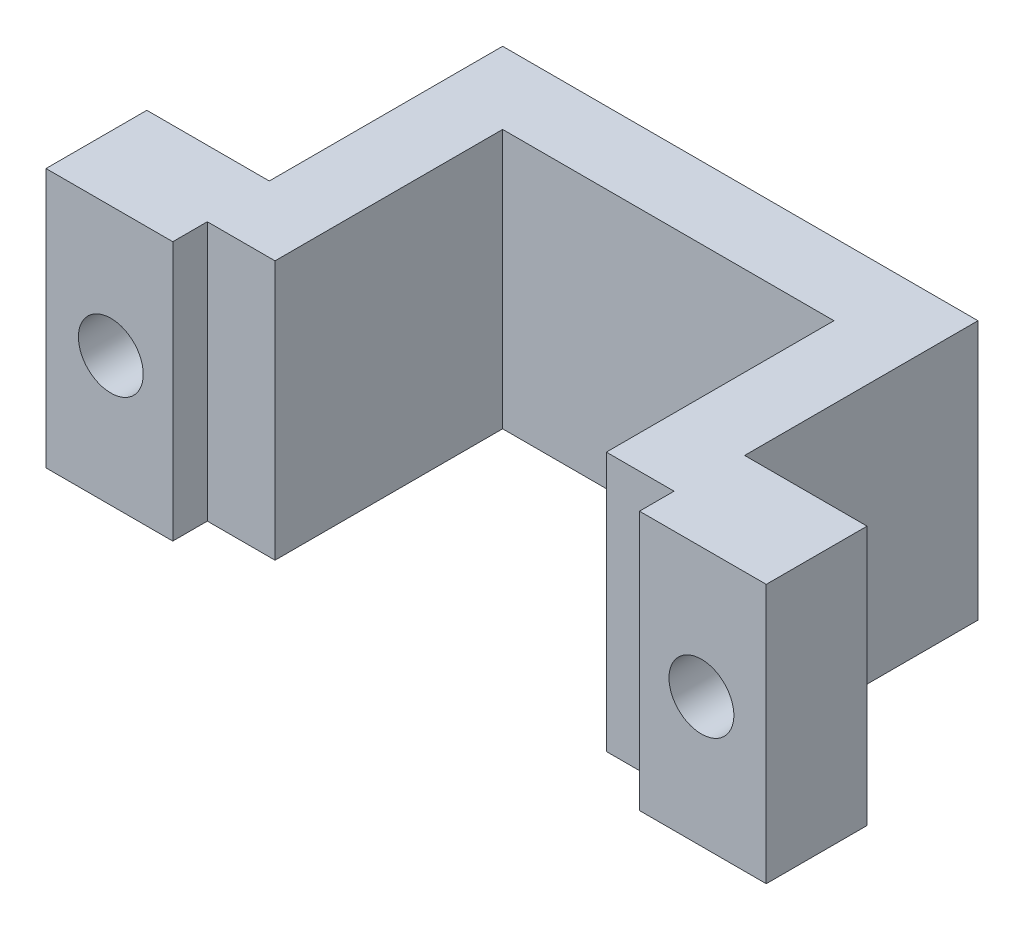
ISO-10303-21;
HEADER;
FILE_DESCRIPTION(('STEP AP214'),'2;1');
FILE_NAME('part.step','',(''),(''),'','','');
FILE_SCHEMA(('AUTOMOTIVE_DESIGN { 1 0 10303 214 1 1 1 1 }'));
ENDSEC;
DATA;
#1=APPLICATION_CONTEXT('core data for automotive mechanical design processes');
#2=APPLICATION_PROTOCOL_DEFINITION('international standard','automotive_design',2000,#1);
#3=PRODUCT_CONTEXT('',#1,'mechanical');
#4=PRODUCT('Part','Part','',(#3));
#5=PRODUCT_RELATED_PRODUCT_CATEGORY('part','',(#4));
#6=PRODUCT_DEFINITION_FORMATION('','',#4);
#7=PRODUCT_DEFINITION_CONTEXT('part definition',#1,'design');
#8=PRODUCT_DEFINITION('design','',#6,#7);
#9=PRODUCT_DEFINITION_SHAPE('','',#8);
#10=(LENGTH_UNIT() NAMED_UNIT(*) SI_UNIT(.MILLI.,.METRE.));
#11=(NAMED_UNIT(*) PLANE_ANGLE_UNIT() SI_UNIT($,.RADIAN.));
#12=(NAMED_UNIT(*) SI_UNIT($,.STERADIAN.) SOLID_ANGLE_UNIT());
#13=UNCERTAINTY_MEASURE_WITH_UNIT(LENGTH_MEASURE(1.E-05),#10,'distance_accuracy_value','');
#14=(GEOMETRIC_REPRESENTATION_CONTEXT(3) GLOBAL_UNCERTAINTY_ASSIGNED_CONTEXT((#13)) GLOBAL_UNIT_ASSIGNED_CONTEXT((#10,
#11,#12)) REPRESENTATION_CONTEXT('',''));
#15=CARTESIAN_POINT('',(0.,0.,0.));
#16=DIRECTION('',(0.,0.,1.));
#17=DIRECTION('',(1.,0.,0.));
#18=AXIS2_PLACEMENT_3D('',#15,#16,#17);
#19=CARTESIAN_POINT('',(0.,18.,0.));
#20=DIRECTION('',(1.,0.,0.));
#21=DIRECTION('',(0.,0.,-1.));
#22=AXIS2_PLACEMENT_3D('',#19,#20,#21);
#23=PLANE('',#22);
#24=DIRECTION('',(0.,0.,1.));
#25=VECTOR('',#24,1.);
#26=CARTESIAN_POINT('',(0.,0.,0.));
#27=LINE('',#26,#25);
#28=CARTESIAN_POINT('',(0.,0.,-7.));
#29=VERTEX_POINT('',#28);
#30=CARTESIAN_POINT('',(0.,0.,0.));
#31=VERTEX_POINT('',#30);
#32=EDGE_CURVE('E178',#29,#31,#27,.T.);
#33=ORIENTED_EDGE('',*,*,#32,.T.);
#34=DIRECTION('',(0.,-1.,0.));
#35=VECTOR('',#34,1.);
#36=CARTESIAN_POINT('',(0.,18.,0.));
#37=LINE('',#36,#35);
#38=CARTESIAN_POINT('',(0.,18.,0.));
#39=VERTEX_POINT('',#38);
#40=EDGE_CURVE('E11',#39,#31,#37,.T.);
#41=ORIENTED_EDGE('',*,*,#40,.F.);
#42=DIRECTION('',(0.,0.,1.));
#43=VECTOR('',#42,1.);
#44=CARTESIAN_POINT('',(0.,18.,0.));
#45=LINE('',#44,#43);
#46=CARTESIAN_POINT('',(0.,18.,-7.));
#47=VERTEX_POINT('',#46);
#48=EDGE_CURVE('E209',#47,#39,#45,.T.);
#49=ORIENTED_EDGE('',*,*,#48,.F.);
#50=DIRECTION('',(0.,-1.,0.));
#51=VECTOR('',#50,1.);
#52=CARTESIAN_POINT('',(0.,18.,-7.));
#53=LINE('',#52,#51);
#54=EDGE_CURVE('E174',#47,#29,#53,.T.);
#55=ORIENTED_EDGE('',*,*,#54,.T.);
#56=EDGE_LOOP('',(#33,#41,#49,#55));
#57=FACE_BOUND('',#56,.T.);
#58=ADVANCED_FACE('F34',(#57),#23,.F.);
#59=CARTESIAN_POINT('',(0.,18.,0.));
#60=DIRECTION('',(0.,0.,-1.));
#61=DIRECTION('',(-1.,0.,0.));
#62=AXIS2_PLACEMENT_3D('',#59,#60,#61);
#63=PLANE('',#62);
#64=CARTESIAN_POINT('',(4.49999999999999,9.,0.));
#65=DIRECTION('',(0.,0.,-1.));
#66=DIRECTION('',(1.,0.,0.));
#67=AXIS2_PLACEMENT_3D('',#64,#65,#66);
#68=CIRCLE('',#67,2.25);
#69=CARTESIAN_POINT('',(6.74999999999999,9.,0.));
#70=VERTEX_POINT('',#69);
#71=EDGE_CURVE('E430',#70,#70,#68,.T.);
#72=ORIENTED_EDGE('',*,*,#71,.T.);
#73=EDGE_LOOP('',(#72));
#74=FACE_BOUND('',#73,.T.);
#75=DIRECTION('',(1.,0.,0.));
#76=VECTOR('',#75,1.);
#77=CARTESIAN_POINT('',(0.,0.,0.));
#78=LINE('',#77,#76);
#79=CARTESIAN_POINT('',(8.8,0.,0.));
#80=VERTEX_POINT('',#79);
#81=EDGE_CURVE('E181',#31,#80,#78,.T.);
#82=ORIENTED_EDGE('',*,*,#81,.T.);
#83=DIRECTION('',(0.,-1.,0.));
#84=VECTOR('',#83,1.);
#85=CARTESIAN_POINT('',(8.8,18.,0.));
#86=LINE('',#85,#84);
#87=CARTESIAN_POINT('',(8.8,18.,0.));
#88=VERTEX_POINT('',#87);
#89=EDGE_CURVE('E42',#88,#80,#86,.T.);
#90=ORIENTED_EDGE('',*,*,#89,.F.);
#91=DIRECTION('',(1.,0.,0.));
#92=VECTOR('',#91,1.);
#93=CARTESIAN_POINT('',(0.,18.,0.));
#94=LINE('',#93,#92);
#95=EDGE_CURVE('E117',#39,#88,#94,.T.);
#96=ORIENTED_EDGE('',*,*,#95,.F.);
#97=ORIENTED_EDGE('',*,*,#40,.T.);
#98=EDGE_LOOP('',(#82,#90,#96,#97));
#99=FACE_BOUND('',#98,.T.);
#100=ADVANCED_FACE('F309',(#74,#99),#63,.F.);
#101=CARTESIAN_POINT('',(8.8,18.,0.));
#102=DIRECTION('',(-1.,0.,0.));
#103=DIRECTION('',(0.,0.,1.));
#104=AXIS2_PLACEMENT_3D('',#101,#102,#103);
#105=PLANE('',#104);
#106=DIRECTION('',(0.,0.,-1.));
#107=VECTOR('',#106,1.);
#108=CARTESIAN_POINT('',(8.8,0.,0.));
#109=LINE('',#108,#107);
#110=CARTESIAN_POINT('',(8.8,0.,-2.4));
#111=VERTEX_POINT('',#110);
#112=EDGE_CURVE('E184',#80,#111,#109,.T.);
#113=ORIENTED_EDGE('',*,*,#112,.T.);
#114=DIRECTION('',(0.,-1.,0.));
#115=VECTOR('',#114,1.);
#116=CARTESIAN_POINT('',(8.8,18.,-2.4));
#117=LINE('',#116,#115);
#118=CARTESIAN_POINT('',(8.8,18.,-2.4));
#119=VERTEX_POINT('',#118);
#120=EDGE_CURVE('E240',#119,#111,#117,.T.);
#121=ORIENTED_EDGE('',*,*,#120,.F.);
#122=DIRECTION('',(0.,0.,-1.));
#123=VECTOR('',#122,1.);
#124=CARTESIAN_POINT('',(8.8,18.,0.));
#125=LINE('',#124,#123);
#126=EDGE_CURVE('E248',#88,#119,#125,.T.);
#127=ORIENTED_EDGE('',*,*,#126,.F.);
#128=ORIENTED_EDGE('',*,*,#89,.T.);
#129=EDGE_LOOP('',(#113,#121,#127,#128));
#130=FACE_BOUND('',#129,.T.);
#131=ADVANCED_FACE('F246',(#130),#105,.F.);
#132=CARTESIAN_POINT('',(8.8,18.,-2.4));
#133=DIRECTION('',(0.,0.,-1.));
#134=DIRECTION('',(-1.,0.,0.));
#135=AXIS2_PLACEMENT_3D('',#132,#133,#134);
#136=PLANE('',#135);
#137=DIRECTION('',(1.,0.,0.));
#138=VECTOR('',#137,1.);
#139=CARTESIAN_POINT('',(8.8,0.,-2.4));
#140=LINE('',#139,#138);
#141=CARTESIAN_POINT('',(13.5,0.,-2.4));
#142=VERTEX_POINT('',#141);
#143=EDGE_CURVE('E186',#111,#142,#140,.T.);
#144=ORIENTED_EDGE('',*,*,#143,.T.);
#145=DIRECTION('',(0.,-1.,0.));
#146=VECTOR('',#145,1.);
#147=CARTESIAN_POINT('',(13.5,18.,-2.4));
#148=LINE('',#147,#146);
#149=CARTESIAN_POINT('',(13.5,18.,-2.4));
#150=VERTEX_POINT('',#149);
#151=EDGE_CURVE('E237',#150,#142,#148,.T.);
#152=ORIENTED_EDGE('',*,*,#151,.F.);
#153=DIRECTION('',(1.,0.,0.));
#154=VECTOR('',#153,1.);
#155=CARTESIAN_POINT('',(8.8,18.,-2.4));
#156=LINE('',#155,#154);
#157=EDGE_CURVE('E266',#119,#150,#156,.T.);
#158=ORIENTED_EDGE('',*,*,#157,.F.);
#159=ORIENTED_EDGE('',*,*,#120,.T.);
#160=EDGE_LOOP('',(#144,#152,#158,#159));
#161=FACE_BOUND('',#160,.T.);
#162=ADVANCED_FACE('F257',(#161),#136,.F.);
#163=CARTESIAN_POINT('',(13.5,18.,-2.4));
#164=DIRECTION('',(-1.,0.,0.));
#165=DIRECTION('',(0.,0.,1.));
#166=AXIS2_PLACEMENT_3D('',#163,#164,#165);
#167=PLANE('',#166);
#168=DIRECTION('',(0.,0.,-1.));
#169=VECTOR('',#168,1.);
#170=CARTESIAN_POINT('',(13.5,0.,-2.4));
#171=LINE('',#170,#169);
#172=CARTESIAN_POINT('',(13.5,0.,-18.2));
#173=VERTEX_POINT('',#172);
#174=EDGE_CURVE('E188',#142,#173,#171,.T.);
#175=ORIENTED_EDGE('',*,*,#174,.T.);
#176=DIRECTION('',(0.,-1.,0.));
#177=VECTOR('',#176,1.);
#178=CARTESIAN_POINT('',(13.5,18.,-18.2));
#179=LINE('',#178,#177);
#180=CARTESIAN_POINT('',(13.5,18.,-18.2));
#181=VERTEX_POINT('',#180);
#182=EDGE_CURVE('E234',#181,#173,#179,.T.);
#183=ORIENTED_EDGE('',*,*,#182,.F.);
#184=DIRECTION('',(0.,0.,-1.));
#185=VECTOR('',#184,1.);
#186=CARTESIAN_POINT('',(13.5,18.,-2.4));
#187=LINE('',#186,#185);
#188=EDGE_CURVE('E263',#150,#181,#187,.T.);
#189=ORIENTED_EDGE('',*,*,#188,.F.);
#190=ORIENTED_EDGE('',*,*,#151,.T.);
#191=EDGE_LOOP('',(#175,#183,#189,#190));
#192=FACE_BOUND('',#191,.T.);
#193=ADVANCED_FACE('F261',(#192),#167,.F.);
#194=CARTESIAN_POINT('',(13.5,18.,-18.2));
#195=DIRECTION('',(0.,0.,-1.));
#196=DIRECTION('',(-1.,0.,0.));
#197=AXIS2_PLACEMENT_3D('',#194,#195,#196);
#198=PLANE('',#197);
#199=DIRECTION('',(1.,0.,0.));
#200=VECTOR('',#199,1.);
#201=CARTESIAN_POINT('',(13.5,0.,-18.2));
#202=LINE('',#201,#200);
#203=CARTESIAN_POINT('',(36.5,0.,-18.2));
#204=VERTEX_POINT('',#203);
#205=EDGE_CURVE('E190',#173,#204,#202,.T.);
#206=ORIENTED_EDGE('',*,*,#205,.T.);
#207=DIRECTION('',(0.,-1.,0.));
#208=VECTOR('',#207,1.);
#209=CARTESIAN_POINT('',(36.5,18.,-18.2));
#210=LINE('',#209,#208);
#211=CARTESIAN_POINT('',(36.5,18.,-18.2));
#212=VERTEX_POINT('',#211);
#213=EDGE_CURVE('E231',#212,#204,#210,.T.);
#214=ORIENTED_EDGE('',*,*,#213,.F.);
#215=DIRECTION('',(1.,0.,0.));
#216=VECTOR('',#215,1.);
#217=CARTESIAN_POINT('',(13.5,18.,-18.2));
#218=LINE('',#217,#216);
#219=EDGE_CURVE('E265',#181,#212,#218,.T.);
#220=ORIENTED_EDGE('',*,*,#219,.F.);
#221=ORIENTED_EDGE('',*,*,#182,.T.);
#222=EDGE_LOOP('',(#206,#214,#220,#221));
#223=FACE_BOUND('',#222,.T.);
#224=ADVANCED_FACE('F324',(#223),#198,.F.);
#225=CARTESIAN_POINT('',(36.5,18.,-2.40000000000001));
#226=DIRECTION('',(1.,0.,0.));
#227=DIRECTION('',(0.,0.,-1.));
#228=AXIS2_PLACEMENT_3D('',#225,#226,#227);
#229=PLANE('',#228);
#230=DIRECTION('',(0.,0.,1.));
#231=VECTOR('',#230,1.);
#232=CARTESIAN_POINT('',(36.5,0.,-2.40000000000001));
#233=LINE('',#232,#231);
#234=CARTESIAN_POINT('',(36.5,0.,-2.40000000000001));
#235=VERTEX_POINT('',#234);
#236=EDGE_CURVE('E192',#204,#235,#233,.T.);
#237=ORIENTED_EDGE('',*,*,#236,.T.);
#238=DIRECTION('',(0.,-1.,0.));
#239=VECTOR('',#238,1.);
#240=CARTESIAN_POINT('',(36.5,18.,-2.40000000000001));
#241=LINE('',#240,#239);
#242=CARTESIAN_POINT('',(36.5,18.,-2.40000000000001));
#243=VERTEX_POINT('',#242);
#244=EDGE_CURVE('E228',#243,#235,#241,.T.);
#245=ORIENTED_EDGE('',*,*,#244,.F.);
#246=DIRECTION('',(0.,0.,1.));
#247=VECTOR('',#246,1.);
#248=CARTESIAN_POINT('',(36.5,18.,-2.40000000000001));
#249=LINE('',#248,#247);
#250=EDGE_CURVE('E268',#212,#243,#249,.T.);
#251=ORIENTED_EDGE('',*,*,#250,.F.);
#252=ORIENTED_EDGE('',*,*,#213,.T.);
#253=EDGE_LOOP('',(#237,#245,#251,#252));
#254=FACE_BOUND('',#253,.T.);
#255=ADVANCED_FACE('F327',(#254),#229,.F.);
#256=CARTESIAN_POINT('',(41.2,18.,-2.40000000000002));
#257=DIRECTION('',(0.,0.,-1.));
#258=DIRECTION('',(-1.,0.,0.));
#259=AXIS2_PLACEMENT_3D('',#256,#257,#258);
#260=PLANE('',#259);
#261=DIRECTION('',(1.,0.,0.));
#262=VECTOR('',#261,1.);
#263=CARTESIAN_POINT('',(41.2,0.,-2.40000000000002));
#264=LINE('',#263,#262);
#265=CARTESIAN_POINT('',(41.2,0.,-2.40000000000002));
#266=VERTEX_POINT('',#265);
#267=EDGE_CURVE('E194',#235,#266,#264,.T.);
#268=ORIENTED_EDGE('',*,*,#267,.T.);
#269=DIRECTION('',(0.,-1.,0.));
#270=VECTOR('',#269,1.);
#271=CARTESIAN_POINT('',(41.2,18.,-2.40000000000002));
#272=LINE('',#271,#270);
#273=CARTESIAN_POINT('',(41.2,18.,-2.40000000000002));
#274=VERTEX_POINT('',#273);
#275=EDGE_CURVE('E225',#274,#266,#272,.T.);
#276=ORIENTED_EDGE('',*,*,#275,.F.);
#277=DIRECTION('',(1.,0.,0.));
#278=VECTOR('',#277,1.);
#279=CARTESIAN_POINT('',(41.2,18.,-2.40000000000002));
#280=LINE('',#279,#278);
#281=EDGE_CURVE('E274',#243,#274,#280,.T.);
#282=ORIENTED_EDGE('',*,*,#281,.F.);
#283=ORIENTED_EDGE('',*,*,#244,.T.);
#284=EDGE_LOOP('',(#268,#276,#282,#283));
#285=FACE_BOUND('',#284,.T.);
#286=ADVANCED_FACE('F331',(#285),#260,.F.);
#287=CARTESIAN_POINT('',(41.2,18.,0.));
#288=DIRECTION('',(1.,0.,0.));
#289=DIRECTION('',(0.,0.,-1.));
#290=AXIS2_PLACEMENT_3D('',#287,#288,#289);
#291=PLANE('',#290);
#292=DIRECTION('',(0.,0.,1.));
#293=VECTOR('',#292,1.);
#294=CARTESIAN_POINT('',(41.2,0.,0.));
#295=LINE('',#294,#293);
#296=CARTESIAN_POINT('',(41.2,0.,0.));
#297=VERTEX_POINT('',#296);
#298=EDGE_CURVE('E196',#266,#297,#295,.T.);
#299=ORIENTED_EDGE('',*,*,#298,.T.);
#300=DIRECTION('',(0.,-1.,0.));
#301=VECTOR('',#300,1.);
#302=CARTESIAN_POINT('',(41.2,18.,0.));
#303=LINE('',#302,#301);
#304=CARTESIAN_POINT('',(41.2,18.,0.));
#305=VERTEX_POINT('',#304);
#306=EDGE_CURVE('E222',#305,#297,#303,.T.);
#307=ORIENTED_EDGE('',*,*,#306,.F.);
#308=DIRECTION('',(0.,0.,1.));
#309=VECTOR('',#308,1.);
#310=CARTESIAN_POINT('',(41.2,18.,0.));
#311=LINE('',#310,#309);
#312=EDGE_CURVE('E276',#274,#305,#311,.T.);
#313=ORIENTED_EDGE('',*,*,#312,.F.);
#314=ORIENTED_EDGE('',*,*,#275,.T.);
#315=EDGE_LOOP('',(#299,#307,#313,#314));
#316=FACE_BOUND('',#315,.T.);
#317=ADVANCED_FACE('F335',(#316),#291,.F.);
#318=CARTESIAN_POINT('',(50.,18.,0.));
#319=DIRECTION('',(0.,0.,-1.));
#320=DIRECTION('',(-1.,0.,0.));
#321=AXIS2_PLACEMENT_3D('',#318,#319,#320);
#322=PLANE('',#321);
#323=CARTESIAN_POINT('',(45.5,9.,0.));
#324=DIRECTION('',(0.,0.,-1.));
#325=DIRECTION('',(-1.,0.,0.));
#326=AXIS2_PLACEMENT_3D('',#323,#324,#325);
#327=CIRCLE('',#326,2.25);
#328=CARTESIAN_POINT('',(43.25,9.,0.));
#329=VERTEX_POINT('',#328);
#330=EDGE_CURVE('E182',#329,#329,#327,.T.);
#331=ORIENTED_EDGE('',*,*,#330,.T.);
#332=EDGE_LOOP('',(#331));
#333=FACE_BOUND('',#332,.T.);
#334=DIRECTION('',(1.,0.,0.));
#335=VECTOR('',#334,1.);
#336=CARTESIAN_POINT('',(50.,0.,0.));
#337=LINE('',#336,#335);
#338=CARTESIAN_POINT('',(50.,0.,0.));
#339=VERTEX_POINT('',#338);
#340=EDGE_CURVE('E198',#297,#339,#337,.T.);
#341=ORIENTED_EDGE('',*,*,#340,.T.);
#342=DIRECTION('',(0.,-1.,0.));
#343=VECTOR('',#342,1.);
#344=CARTESIAN_POINT('',(50.,18.,0.));
#345=LINE('',#344,#343);
#346=CARTESIAN_POINT('',(50.,18.,0.));
#347=VERTEX_POINT('',#346);
#348=EDGE_CURVE('E219',#347,#339,#345,.T.);
#349=ORIENTED_EDGE('',*,*,#348,.F.);
#350=DIRECTION('',(1.,0.,0.));
#351=VECTOR('',#350,1.);
#352=CARTESIAN_POINT('',(50.,18.,0.));
#353=LINE('',#352,#351);
#354=EDGE_CURVE('E278',#305,#347,#353,.T.);
#355=ORIENTED_EDGE('',*,*,#354,.F.);
#356=ORIENTED_EDGE('',*,*,#306,.T.);
#357=EDGE_LOOP('',(#341,#349,#355,#356));
#358=FACE_BOUND('',#357,.T.);
#359=ADVANCED_FACE('F339',(#333,#358),#322,.F.);
#360=CARTESIAN_POINT('',(50.,18.,0.));
#361=DIRECTION('',(-1.,0.,0.));
#362=DIRECTION('',(0.,0.,1.));
#363=AXIS2_PLACEMENT_3D('',#360,#361,#362);
#364=PLANE('',#363);
#365=DIRECTION('',(0.,0.,-1.));
#366=VECTOR('',#365,1.);
#367=CARTESIAN_POINT('',(50.,0.,0.));
#368=LINE('',#367,#366);
#369=CARTESIAN_POINT('',(50.,0.,-7.00000000000001));
#370=VERTEX_POINT('',#369);
#371=EDGE_CURVE('E200',#339,#370,#368,.T.);
#372=ORIENTED_EDGE('',*,*,#371,.T.);
#373=DIRECTION('',(0.,-1.,0.));
#374=VECTOR('',#373,1.);
#375=CARTESIAN_POINT('',(50.,18.,-7.00000000000001));
#376=LINE('',#375,#374);
#377=CARTESIAN_POINT('',(50.,18.,-7.00000000000001));
#378=VERTEX_POINT('',#377);
#379=EDGE_CURVE('E216',#378,#370,#376,.T.);
#380=ORIENTED_EDGE('',*,*,#379,.F.);
#381=DIRECTION('',(0.,0.,-1.));
#382=VECTOR('',#381,1.);
#383=CARTESIAN_POINT('',(50.,18.,0.));
#384=LINE('',#383,#382);
#385=EDGE_CURVE('E280',#347,#378,#384,.T.);
#386=ORIENTED_EDGE('',*,*,#385,.F.);
#387=ORIENTED_EDGE('',*,*,#348,.T.);
#388=EDGE_LOOP('',(#372,#380,#386,#387));
#389=FACE_BOUND('',#388,.T.);
#390=ADVANCED_FACE('F343',(#389),#364,.F.);
#391=CARTESIAN_POINT('',(50.,18.,-7.00000000000001));
#392=DIRECTION('',(0.,0.,1.));
#393=DIRECTION('',(1.,0.,0.));
#394=AXIS2_PLACEMENT_3D('',#391,#392,#393);
#395=PLANE('',#394);
#396=CARTESIAN_POINT('',(45.5,9.,-7.));
#397=DIRECTION('',(0.,0.,-1.));
#398=DIRECTION('',(-1.,0.,0.));
#399=AXIS2_PLACEMENT_3D('',#396,#397,#398);
#400=CIRCLE('',#399,2.25);
#401=CARTESIAN_POINT('',(43.25,9.,-7.));
#402=VERTEX_POINT('',#401);
#403=EDGE_CURVE('E429',#402,#402,#400,.T.);
#404=ORIENTED_EDGE('',*,*,#403,.F.);
#405=EDGE_LOOP('',(#404));
#406=FACE_BOUND('',#405,.T.);
#407=DIRECTION('',(-1.,0.,0.));
#408=VECTOR('',#407,1.);
#409=CARTESIAN_POINT('',(50.,0.,-7.00000000000001));
#410=LINE('',#409,#408);
#411=CARTESIAN_POINT('',(41.5,0.,-7.));
#412=VERTEX_POINT('',#411);
#413=EDGE_CURVE('E202',#370,#412,#410,.T.);
#414=ORIENTED_EDGE('',*,*,#413,.T.);
#415=DIRECTION('',(0.,-1.,0.));
#416=VECTOR('',#415,1.);
#417=CARTESIAN_POINT('',(41.5,18.,-7.));
#418=LINE('',#417,#416);
#419=CARTESIAN_POINT('',(41.5,18.,-7.));
#420=VERTEX_POINT('',#419);
#421=EDGE_CURVE('E213',#420,#412,#418,.T.);
#422=ORIENTED_EDGE('',*,*,#421,.F.);
#423=DIRECTION('',(-1.,0.,0.));
#424=VECTOR('',#423,1.);
#425=CARTESIAN_POINT('',(50.,18.,-7.00000000000001));
#426=LINE('',#425,#424);
#427=EDGE_CURVE('E282',#378,#420,#426,.T.);
#428=ORIENTED_EDGE('',*,*,#427,.F.);
#429=ORIENTED_EDGE('',*,*,#379,.T.);
#430=EDGE_LOOP('',(#414,#422,#428,#429));
#431=FACE_BOUND('',#430,.T.);
#432=ADVANCED_FACE('F288',(#406,#431),#395,.F.);
#433=CARTESIAN_POINT('',(41.5,18.,-7.));
#434=DIRECTION('',(-1.,0.,0.));
#435=DIRECTION('',(0.,0.,1.));
#436=AXIS2_PLACEMENT_3D('',#433,#434,#435);
#437=PLANE('',#436);
#438=DIRECTION('',(0.,0.,-1.));
#439=VECTOR('',#438,1.);
#440=CARTESIAN_POINT('',(41.5,0.,-7.));
#441=LINE('',#440,#439);
#442=CARTESIAN_POINT('',(41.5,0.,-23.2));
#443=VERTEX_POINT('',#442);
#444=EDGE_CURVE('E204',#412,#443,#441,.T.);
#445=ORIENTED_EDGE('',*,*,#444,.T.);
#446=DIRECTION('',(0.,-1.,0.));
#447=VECTOR('',#446,1.);
#448=CARTESIAN_POINT('',(41.5,18.,-23.2));
#449=LINE('',#448,#447);
#450=CARTESIAN_POINT('',(41.5,18.,-23.2));
#451=VERTEX_POINT('',#450);
#452=EDGE_CURVE('E169',#451,#443,#449,.T.);
#453=ORIENTED_EDGE('',*,*,#452,.F.);
#454=DIRECTION('',(0.,0.,-1.));
#455=VECTOR('',#454,1.);
#456=CARTESIAN_POINT('',(41.5,18.,-7.));
#457=LINE('',#456,#455);
#458=EDGE_CURVE('E160',#420,#451,#457,.T.);
#459=ORIENTED_EDGE('',*,*,#458,.F.);
#460=ORIENTED_EDGE('',*,*,#421,.T.);
#461=EDGE_LOOP('',(#445,#453,#459,#460));
#462=FACE_BOUND('',#461,.T.);
#463=ADVANCED_FACE('F292',(#462),#437,.F.);
#464=CARTESIAN_POINT('',(8.5,18.,-23.2));
#465=DIRECTION('',(0.,0.,1.));
#466=DIRECTION('',(1.,0.,0.));
#467=AXIS2_PLACEMENT_3D('',#464,#465,#466);
#468=PLANE('',#467);
#469=DIRECTION('',(-1.,0.,0.));
#470=VECTOR('',#469,1.);
#471=CARTESIAN_POINT('',(8.5,0.,-23.2));
#472=LINE('',#471,#470);
#473=CARTESIAN_POINT('',(8.5,0.,-23.2));
#474=VERTEX_POINT('',#473);
#475=EDGE_CURVE('E168',#443,#474,#472,.T.);
#476=ORIENTED_EDGE('',*,*,#475,.T.);
#477=DIRECTION('',(0.,-1.,0.));
#478=VECTOR('',#477,1.);
#479=CARTESIAN_POINT('',(8.5,18.,-23.2));
#480=LINE('',#479,#478);
#481=CARTESIAN_POINT('',(8.5,18.,-23.2));
#482=VERTEX_POINT('',#481);
#483=EDGE_CURVE('E165',#482,#474,#480,.T.);
#484=ORIENTED_EDGE('',*,*,#483,.F.);
#485=DIRECTION('',(-1.,0.,0.));
#486=VECTOR('',#485,1.);
#487=CARTESIAN_POINT('',(8.5,18.,-23.2));
#488=LINE('',#487,#486);
#489=EDGE_CURVE('E154',#451,#482,#488,.T.);
#490=ORIENTED_EDGE('',*,*,#489,.F.);
#491=ORIENTED_EDGE('',*,*,#452,.T.);
#492=EDGE_LOOP('',(#476,#484,#490,#491));
#493=FACE_BOUND('',#492,.T.);
#494=ADVANCED_FACE('F166',(#493),#468,.F.);
#495=CARTESIAN_POINT('',(8.5,18.,-7.));
#496=DIRECTION('',(1.,0.,0.));
#497=DIRECTION('',(0.,0.,-1.));
#498=AXIS2_PLACEMENT_3D('',#495,#496,#497);
#499=PLANE('',#498);
#500=DIRECTION('',(0.,0.,1.));
#501=VECTOR('',#500,1.);
#502=CARTESIAN_POINT('',(8.5,0.,-7.));
#503=LINE('',#502,#501);
#504=CARTESIAN_POINT('',(8.5,0.,-7.));
#505=VERTEX_POINT('',#504);
#506=EDGE_CURVE('E103',#474,#505,#503,.T.);
#507=ORIENTED_EDGE('',*,*,#506,.T.);
#508=DIRECTION('',(0.,-1.,0.));
#509=VECTOR('',#508,1.);
#510=CARTESIAN_POINT('',(8.5,18.,-7.));
#511=LINE('',#510,#509);
#512=CARTESIAN_POINT('',(8.5,18.,-7.));
#513=VERTEX_POINT('',#512);
#514=EDGE_CURVE('E170',#513,#505,#511,.T.);
#515=ORIENTED_EDGE('',*,*,#514,.F.);
#516=DIRECTION('',(0.,0.,1.));
#517=VECTOR('',#516,1.);
#518=CARTESIAN_POINT('',(8.5,18.,-7.));
#519=LINE('',#518,#517);
#520=EDGE_CURVE('E158',#482,#513,#519,.T.);
#521=ORIENTED_EDGE('',*,*,#520,.F.);
#522=ORIENTED_EDGE('',*,*,#483,.T.);
#523=EDGE_LOOP('',(#507,#515,#521,#522));
#524=FACE_BOUND('',#523,.T.);
#525=ADVANCED_FACE('F172',(#524),#499,.F.);
#526=CARTESIAN_POINT('',(0.,18.,-7.));
#527=DIRECTION('',(0.,0.,1.));
#528=DIRECTION('',(1.,0.,0.));
#529=AXIS2_PLACEMENT_3D('',#526,#527,#528);
#530=PLANE('',#529);
#531=CARTESIAN_POINT('',(4.49999999999999,9.,-7.));
#532=DIRECTION('',(0.,0.,-1.));
#533=DIRECTION('',(1.,0.,0.));
#534=AXIS2_PLACEMENT_3D('',#531,#532,#533);
#535=CIRCLE('',#534,2.25);
#536=CARTESIAN_POINT('',(6.74999999999999,9.,-7.));
#537=VERTEX_POINT('',#536);
#538=EDGE_CURVE('E433',#537,#537,#535,.T.);
#539=ORIENTED_EDGE('',*,*,#538,.F.);
#540=EDGE_LOOP('',(#539));
#541=FACE_BOUND('',#540,.T.);
#542=DIRECTION('',(-1.,0.,0.));
#543=VECTOR('',#542,1.);
#544=CARTESIAN_POINT('',(0.,0.,-7.));
#545=LINE('',#544,#543);
#546=EDGE_CURVE('E109',#505,#29,#545,.T.);
#547=ORIENTED_EDGE('',*,*,#546,.T.);
#548=ORIENTED_EDGE('',*,*,#54,.F.);
#549=DIRECTION('',(-1.,0.,0.));
#550=VECTOR('',#549,1.);
#551=CARTESIAN_POINT('',(0.,18.,-7.));
#552=LINE('',#551,#550);
#553=EDGE_CURVE('E50',#513,#47,#552,.T.);
#554=ORIENTED_EDGE('',*,*,#553,.F.);
#555=ORIENTED_EDGE('',*,*,#514,.T.);
#556=EDGE_LOOP('',(#547,#548,#554,#555));
#557=FACE_BOUND('',#556,.T.);
#558=ADVANCED_FACE('F296',(#541,#557),#530,.F.);
#559=CARTESIAN_POINT('',(0.,18.,0.));
#560=DIRECTION('',(0.,-1.,0.));
#561=DIRECTION('',(0.,0.,-1.));
#562=AXIS2_PLACEMENT_3D('',#559,#560,#561);
#563=PLANE('',#562);
#564=ORIENTED_EDGE('',*,*,#48,.T.);
#565=ORIENTED_EDGE('',*,*,#95,.T.);
#566=ORIENTED_EDGE('',*,*,#126,.T.);
#567=ORIENTED_EDGE('',*,*,#157,.T.);
#568=ORIENTED_EDGE('',*,*,#188,.T.);
#569=ORIENTED_EDGE('',*,*,#219,.T.);
#570=ORIENTED_EDGE('',*,*,#250,.T.);
#571=ORIENTED_EDGE('',*,*,#281,.T.);
#572=ORIENTED_EDGE('',*,*,#312,.T.);
#573=ORIENTED_EDGE('',*,*,#354,.T.);
#574=ORIENTED_EDGE('',*,*,#385,.T.);
#575=ORIENTED_EDGE('',*,*,#427,.T.);
#576=ORIENTED_EDGE('',*,*,#458,.T.);
#577=ORIENTED_EDGE('',*,*,#489,.T.);
#578=ORIENTED_EDGE('',*,*,#520,.T.);
#579=ORIENTED_EDGE('',*,*,#553,.T.);
#580=EDGE_LOOP('',(#564,#565,#566,#567,#568,#569,#570,#571,#572,#573,#574,#575,#576,#577,#578,#579));
#581=FACE_BOUND('',#580,.T.);
#582=ADVANCED_FACE('F156',(#581),#563,.F.);
#583=CARTESIAN_POINT('',(0.,0.,0.));
#584=DIRECTION('',(0.,-1.,0.));
#585=DIRECTION('',(0.,0.,-1.));
#586=AXIS2_PLACEMENT_3D('',#583,#584,#585);
#587=PLANE('',#586);
#588=ORIENTED_EDGE('',*,*,#32,.F.);
#589=ORIENTED_EDGE('',*,*,#546,.F.);
#590=ORIENTED_EDGE('',*,*,#506,.F.);
#591=ORIENTED_EDGE('',*,*,#475,.F.);
#592=ORIENTED_EDGE('',*,*,#444,.F.);
#593=ORIENTED_EDGE('',*,*,#413,.F.);
#594=ORIENTED_EDGE('',*,*,#371,.F.);
#595=ORIENTED_EDGE('',*,*,#340,.F.);
#596=ORIENTED_EDGE('',*,*,#298,.F.);
#597=ORIENTED_EDGE('',*,*,#267,.F.);
#598=ORIENTED_EDGE('',*,*,#236,.F.);
#599=ORIENTED_EDGE('',*,*,#205,.F.);
#600=ORIENTED_EDGE('',*,*,#174,.F.);
#601=ORIENTED_EDGE('',*,*,#143,.F.);
#602=ORIENTED_EDGE('',*,*,#112,.F.);
#603=ORIENTED_EDGE('',*,*,#81,.F.);
#604=EDGE_LOOP('',(#588,#589,#590,#591,#592,#593,#594,#595,#596,#597,#598,#599,#600,#601,#602,#603));
#605=FACE_BOUND('',#604,.T.);
#606=ADVANCED_FACE('F252',(#605),#587,.T.);
#607=CARTESIAN_POINT('',(4.49999999999999,9.,0.));
#608=DIRECTION('',(0.,0.,-1.));
#609=DIRECTION('',(-1.,0.,0.));
#610=AXIS2_PLACEMENT_3D('',#607,#608,#609);
#611=CYLINDRICAL_SURFACE('',#610,2.25);
#612=ORIENTED_EDGE('',*,*,#71,.F.);
#613=EDGE_LOOP('',(#612));
#614=FACE_BOUND('',#613,.T.);
#615=ORIENTED_EDGE('',*,*,#538,.T.);
#616=EDGE_LOOP('',(#615));
#617=FACE_BOUND('',#616,.T.);
#618=ADVANCED_FACE('F377',(#614,#617),#611,.F.);
#619=CARTESIAN_POINT('',(45.5,9.,0.));
#620=DIRECTION('',(0.,0.,-1.));
#621=DIRECTION('',(-1.,0.,0.));
#622=AXIS2_PLACEMENT_3D('',#619,#620,#621);
#623=CYLINDRICAL_SURFACE('',#622,2.25);
#624=ORIENTED_EDGE('',*,*,#330,.F.);
#625=EDGE_LOOP('',(#624));
#626=FACE_BOUND('',#625,.T.);
#627=ORIENTED_EDGE('',*,*,#403,.T.);
#628=EDGE_LOOP('',(#627));
#629=FACE_BOUND('',#628,.T.);
#630=ADVANCED_FACE('F410',(#626,#629),#623,.F.);
#631=CLOSED_SHELL('',(#58,#100,#131,#162,#193,#224,#255,#286,#317,#359,#390,#432,#463,#494,#525,
#558,#582,#606,#618,#630));
#632=MANIFOLD_SOLID_BREP('B2',#631);
#633=ADVANCED_BREP_SHAPE_REPRESENTATION('',(#18,#632),#14);
#634=SHAPE_DEFINITION_REPRESENTATION(#9,#633);
ENDSEC;
END-ISO-10303-21;
